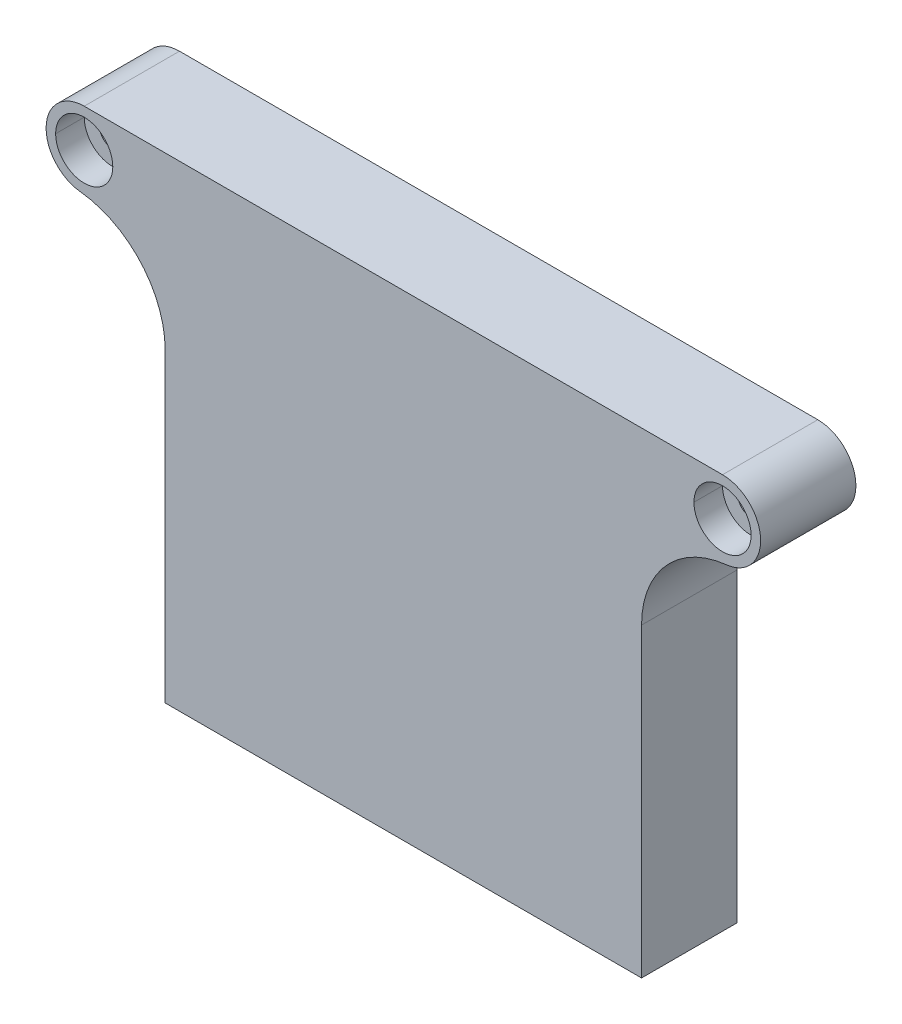
ISO-10303-21;
HEADER;
FILE_DESCRIPTION(('STEP AP214'),'2;1');
FILE_NAME('part.step','',(''),(''),'','','');
FILE_SCHEMA(('AUTOMOTIVE_DESIGN { 1 0 10303 214 1 1 1 1 }'));
ENDSEC;
DATA;
#1=APPLICATION_CONTEXT('core data for automotive mechanical design processes');
#2=APPLICATION_PROTOCOL_DEFINITION('international standard','automotive_design',2000,#1);
#3=PRODUCT_CONTEXT('',#1,'mechanical');
#4=PRODUCT('Part','Part','',(#3));
#5=PRODUCT_RELATED_PRODUCT_CATEGORY('part','',(#4));
#6=PRODUCT_DEFINITION_FORMATION('','',#4);
#7=PRODUCT_DEFINITION_CONTEXT('part definition',#1,'design');
#8=PRODUCT_DEFINITION('design','',#6,#7);
#9=PRODUCT_DEFINITION_SHAPE('','',#8);
#10=(LENGTH_UNIT() NAMED_UNIT(*) SI_UNIT(.MILLI.,.METRE.));
#11=(NAMED_UNIT(*) PLANE_ANGLE_UNIT() SI_UNIT($,.RADIAN.));
#12=(NAMED_UNIT(*) SI_UNIT($,.STERADIAN.) SOLID_ANGLE_UNIT());
#13=UNCERTAINTY_MEASURE_WITH_UNIT(LENGTH_MEASURE(1.E-05),#10,'distance_accuracy_value','');
#14=(GEOMETRIC_REPRESENTATION_CONTEXT(3) GLOBAL_UNCERTAINTY_ASSIGNED_CONTEXT((#13)) GLOBAL_UNIT_ASSIGNED_CONTEXT((#10,
#11,#12)) REPRESENTATION_CONTEXT('',''));
#15=CARTESIAN_POINT('',(0.,0.,0.));
#16=DIRECTION('',(0.,0.,1.));
#17=DIRECTION('',(1.,0.,0.));
#18=AXIS2_PLACEMENT_3D('',#15,#16,#17);
#19=CARTESIAN_POINT('',(13.5,-36.,5.));
#20=DIRECTION('',(0.,-1.,0.));
#21=DIRECTION('',(0.,0.,-1.));
#22=AXIS2_PLACEMENT_3D('',#19,#20,#21);
#23=PLANE('',#22);
#24=CARTESIAN_POINT('',(13.5,-36.,5.));
#25=DIRECTION('',(0.,-1.,0.));
#26=DIRECTION('',(1.,0.,0.));
#27=AXIS2_PLACEMENT_3D('',#24,#25,#26);
#28=CIRCLE('',#27,1.4);
#29=CARTESIAN_POINT('',(14.9,-36.,5.));
#30=VERTEX_POINT('',#29);
#31=CARTESIAN_POINT('',(12.1,-36.,5.));
#32=VERTEX_POINT('',#31);
#33=EDGE_CURVE('E10',#30,#32,#28,.T.);
#34=ORIENTED_EDGE('',*,*,#33,.T.);
#35=CARTESIAN_POINT('',(13.5,-36.,5.));
#36=DIRECTION('',(0.,-1.,0.));
#37=DIRECTION('',(1.,0.,0.));
#38=AXIS2_PLACEMENT_3D('',#35,#36,#37);
#39=CIRCLE('',#38,1.4);
#40=EDGE_CURVE('E1050',#32,#30,#39,.T.);
#41=ORIENTED_EDGE('',*,*,#40,.T.);
#42=EDGE_LOOP('',(#34,#41));
#43=FACE_BOUND('',#42,.T.);
#44=ADVANCED_FACE('F16',(#43),#23,.T.);
#45=CARTESIAN_POINT('',(13.5,-36.,5.));
#46=DIRECTION('',(0.,-1.,0.));
#47=DIRECTION('',(1.,0.,0.));
#48=AXIS2_PLACEMENT_3D('',#45,#46,#47);
#49=CYLINDRICAL_SURFACE('',#48,1.4);
#50=DIRECTION('',(0.,-1.,0.));
#51=VECTOR('',#50,1.);
#52=CARTESIAN_POINT('',(12.1,-36.,5.));
#53=LINE('',#52,#51);
#54=CARTESIAN_POINT('',(12.1,-46.,5.));
#55=VERTEX_POINT('',#54);
#56=EDGE_CURVE('E1053',#32,#55,#53,.T.);
#57=ORIENTED_EDGE('',*,*,#56,.F.);
#58=ORIENTED_EDGE('',*,*,#33,.F.);
#59=DIRECTION('',(0.,-1.,0.));
#60=VECTOR('',#59,1.);
#61=CARTESIAN_POINT('',(14.9,-36.,5.));
#62=LINE('',#61,#60);
#63=CARTESIAN_POINT('',(14.9,-46.,5.));
#64=VERTEX_POINT('',#63);
#65=EDGE_CURVE('E343',#30,#64,#62,.T.);
#66=ORIENTED_EDGE('',*,*,#65,.T.);
#67=CARTESIAN_POINT('',(13.5,-46.,5.));
#68=DIRECTION('',(0.,-1.,0.));
#69=DIRECTION('',(1.,0.,0.));
#70=AXIS2_PLACEMENT_3D('',#67,#68,#69);
#71=CIRCLE('',#70,1.4);
#72=EDGE_CURVE('E293',#64,#55,#71,.T.);
#73=ORIENTED_EDGE('',*,*,#72,.T.);
#74=EDGE_LOOP('',(#57,#58,#66,#73));
#75=FACE_BOUND('',#74,.T.);
#76=ADVANCED_FACE('F18',(#75),#49,.F.);
#77=CARTESIAN_POINT('',(53.5,-36.,5.));
#78=DIRECTION('',(0.,-1.,0.));
#79=DIRECTION('',(0.,0.,-1.));
#80=AXIS2_PLACEMENT_3D('',#77,#78,#79);
#81=PLANE('',#80);
#82=CARTESIAN_POINT('',(53.5,-36.,5.));
#83=DIRECTION('',(0.,-1.,0.));
#84=DIRECTION('',(1.,0.,0.));
#85=AXIS2_PLACEMENT_3D('',#82,#83,#84);
#86=CIRCLE('',#85,1.4);
#87=CARTESIAN_POINT('',(54.9,-36.,5.));
#88=VERTEX_POINT('',#87);
#89=CARTESIAN_POINT('',(52.1,-36.,5.));
#90=VERTEX_POINT('',#89);
#91=EDGE_CURVE('E20',#88,#90,#86,.T.);
#92=ORIENTED_EDGE('',*,*,#91,.T.);
#93=CARTESIAN_POINT('',(53.5,-36.,5.));
#94=DIRECTION('',(0.,-1.,0.));
#95=DIRECTION('',(1.,0.,0.));
#96=AXIS2_PLACEMENT_3D('',#93,#94,#95);
#97=CIRCLE('',#96,1.4);
#98=EDGE_CURVE('E325',#90,#88,#97,.T.);
#99=ORIENTED_EDGE('',*,*,#98,.T.);
#100=EDGE_LOOP('',(#92,#99));
#101=FACE_BOUND('',#100,.T.);
#102=ADVANCED_FACE('F323',(#101),#81,.T.);
#103=CARTESIAN_POINT('',(53.5,-36.,5.));
#104=DIRECTION('',(0.,-1.,0.));
#105=DIRECTION('',(1.,0.,0.));
#106=AXIS2_PLACEMENT_3D('',#103,#104,#105);
#107=CYLINDRICAL_SURFACE('',#106,1.4);
#108=DIRECTION('',(0.,-1.,0.));
#109=VECTOR('',#108,1.);
#110=CARTESIAN_POINT('',(52.1,-36.,5.));
#111=LINE('',#110,#109);
#112=CARTESIAN_POINT('',(52.1,-46.,5.));
#113=VERTEX_POINT('',#112);
#114=EDGE_CURVE('E332',#90,#113,#111,.T.);
#115=ORIENTED_EDGE('',*,*,#114,.F.);
#116=ORIENTED_EDGE('',*,*,#91,.F.);
#117=DIRECTION('',(0.,-1.,0.));
#118=VECTOR('',#117,1.);
#119=CARTESIAN_POINT('',(54.9,-36.,5.));
#120=LINE('',#119,#118);
#121=CARTESIAN_POINT('',(54.9,-46.,5.));
#122=VERTEX_POINT('',#121);
#123=EDGE_CURVE('E341',#88,#122,#120,.T.);
#124=ORIENTED_EDGE('',*,*,#123,.T.);
#125=CARTESIAN_POINT('',(53.5,-46.,5.));
#126=DIRECTION('',(0.,-1.,0.));
#127=DIRECTION('',(1.,0.,0.));
#128=AXIS2_PLACEMENT_3D('',#125,#126,#127);
#129=CIRCLE('',#128,1.4);
#130=EDGE_CURVE('E304',#122,#113,#129,.T.);
#131=ORIENTED_EDGE('',*,*,#130,.T.);
#132=EDGE_LOOP('',(#115,#116,#124,#131));
#133=FACE_BOUND('',#132,.T.);
#134=ADVANCED_FACE('F333',(#133),#107,.F.);
#135=CARTESIAN_POINT('',(33.5,-36.,5.));
#136=DIRECTION('',(0.,-1.,0.));
#137=DIRECTION('',(0.,0.,-1.));
#138=AXIS2_PLACEMENT_3D('',#135,#136,#137);
#139=PLANE('',#138);
#140=CARTESIAN_POINT('',(33.5,-36.,5.));
#141=DIRECTION('',(0.,-1.,0.));
#142=DIRECTION('',(1.,0.,0.));
#143=AXIS2_PLACEMENT_3D('',#140,#141,#142);
#144=CIRCLE('',#143,1.4);
#145=CARTESIAN_POINT('',(34.9,-36.,5.));
#146=VERTEX_POINT('',#145);
#147=CARTESIAN_POINT('',(32.1,-36.,5.));
#148=VERTEX_POINT('',#147);
#149=EDGE_CURVE('E205',#146,#148,#144,.T.);
#150=ORIENTED_EDGE('',*,*,#149,.T.);
#151=CARTESIAN_POINT('',(33.5,-36.,5.));
#152=DIRECTION('',(0.,-1.,0.));
#153=DIRECTION('',(1.,0.,0.));
#154=AXIS2_PLACEMENT_3D('',#151,#152,#153);
#155=CIRCLE('',#154,1.4);
#156=EDGE_CURVE('E364',#148,#146,#155,.T.);
#157=ORIENTED_EDGE('',*,*,#156,.T.);
#158=EDGE_LOOP('',(#150,#157));
#159=FACE_BOUND('',#158,.T.);
#160=ADVANCED_FACE('F511',(#159),#139,.T.);
#161=CARTESIAN_POINT('',(33.5,-36.,5.));
#162=DIRECTION('',(0.,-1.,0.));
#163=DIRECTION('',(1.,0.,0.));
#164=AXIS2_PLACEMENT_3D('',#161,#162,#163);
#165=CYLINDRICAL_SURFACE('',#164,1.4);
#166=DIRECTION('',(0.,-1.,0.));
#167=VECTOR('',#166,1.);
#168=CARTESIAN_POINT('',(32.1,-36.,5.));
#169=LINE('',#168,#167);
#170=CARTESIAN_POINT('',(32.1,-46.,5.));
#171=VERTEX_POINT('',#170);
#172=EDGE_CURVE('E367',#148,#171,#169,.T.);
#173=ORIENTED_EDGE('',*,*,#172,.F.);
#174=ORIENTED_EDGE('',*,*,#149,.F.);
#175=DIRECTION('',(0.,-1.,0.));
#176=VECTOR('',#175,1.);
#177=CARTESIAN_POINT('',(34.9,-36.,5.));
#178=LINE('',#177,#176);
#179=CARTESIAN_POINT('',(34.9,-46.,5.));
#180=VERTEX_POINT('',#179);
#181=EDGE_CURVE('E1033',#146,#180,#178,.T.);
#182=ORIENTED_EDGE('',*,*,#181,.T.);
#183=CARTESIAN_POINT('',(33.5,-46.,5.));
#184=DIRECTION('',(0.,-1.,0.));
#185=DIRECTION('',(1.,0.,0.));
#186=AXIS2_PLACEMENT_3D('',#183,#184,#185);
#187=CIRCLE('',#186,1.4);
#188=EDGE_CURVE('E206',#180,#171,#187,.T.);
#189=ORIENTED_EDGE('',*,*,#188,.T.);
#190=EDGE_LOOP('',(#173,#174,#182,#189));
#191=FACE_BOUND('',#190,.T.);
#192=ADVANCED_FACE('F508',(#191),#165,.F.);
#193=CARTESIAN_POINT('',(-1.5,-13.9194109070751,10.));
#194=DIRECTION('',(0.,0.,-1.));
#195=DIRECTION('',(-1.,0.,0.));
#196=AXIS2_PLACEMENT_3D('',#193,#194,#195);
#197=CYLINDRICAL_SURFACE('',#196,10.);
#198=CARTESIAN_POINT('',(-1.5,-13.9194109070751,0.));
#199=DIRECTION('',(0.,0.,1.));
#200=DIRECTION('',(1.,0.,0.));
#201=AXIS2_PLACEMENT_3D('',#198,#199,#200);
#202=CIRCLE('',#201,10.);
#203=CARTESIAN_POINT('',(8.5,-13.919410907075,0.));
#204=VERTEX_POINT('',#203);
#205=CARTESIAN_POINT('',(-0.428571428571427,-3.97697454487859,0.));
#206=VERTEX_POINT('',#205);
#207=EDGE_CURVE('E209',#204,#206,#202,.T.);
#208=ORIENTED_EDGE('',*,*,#207,.F.);
#209=DIRECTION('',(0.,0.,-1.));
#210=VECTOR('',#209,1.);
#211=CARTESIAN_POINT('',(8.5,-13.9194109070751,0.));
#212=LINE('',#211,#210);
#213=CARTESIAN_POINT('',(8.5,-13.919410907075,10.));
#214=VERTEX_POINT('',#213);
#215=EDGE_CURVE('E195',#214,#204,#212,.T.);
#216=ORIENTED_EDGE('',*,*,#215,.F.);
#217=CARTESIAN_POINT('',(-1.5,-13.9194109070751,10.));
#218=DIRECTION('',(0.,0.,-1.));
#219=DIRECTION('',(1.,0.,0.));
#220=AXIS2_PLACEMENT_3D('',#217,#218,#219);
#221=CIRCLE('',#220,10.);
#222=CARTESIAN_POINT('',(-0.428571428571427,-3.97697454487859,10.));
#223=VERTEX_POINT('',#222);
#224=EDGE_CURVE('E281',#223,#214,#221,.T.);
#225=ORIENTED_EDGE('',*,*,#224,.F.);
#226=DIRECTION('',(0.,0.,1.));
#227=VECTOR('',#226,1.);
#228=CARTESIAN_POINT('',(-0.428571428571427,-3.97697454487859,10.));
#229=LINE('',#228,#227);
#230=EDGE_CURVE('E212',#206,#223,#229,.T.);
#231=ORIENTED_EDGE('',*,*,#230,.F.);
#232=EDGE_LOOP('',(#208,#216,#225,#231));
#233=FACE_BOUND('',#232,.T.);
#234=ADVANCED_FACE('F210',(#233),#197,.F.);
#235=CARTESIAN_POINT('',(68.5,-13.9194109070751,10.));
#236=DIRECTION('',(0.,0.,-1.));
#237=DIRECTION('',(-1.,0.,0.));
#238=AXIS2_PLACEMENT_3D('',#235,#236,#237);
#239=CYLINDRICAL_SURFACE('',#238,10.);
#240=CARTESIAN_POINT('',(68.5,-13.9194109070751,0.));
#241=DIRECTION('',(0.,0.,1.));
#242=DIRECTION('',(1.,0.,0.));
#243=AXIS2_PLACEMENT_3D('',#240,#241,#242);
#244=CIRCLE('',#243,10.);
#245=CARTESIAN_POINT('',(67.4285714285714,-3.97697454487859,0.));
#246=VERTEX_POINT('',#245);
#247=CARTESIAN_POINT('',(58.5,-13.9194109070751,0.));
#248=VERTEX_POINT('',#247);
#249=EDGE_CURVE('E217',#246,#248,#244,.T.);
#250=ORIENTED_EDGE('',*,*,#249,.F.);
#251=DIRECTION('',(0.,0.,-1.));
#252=VECTOR('',#251,1.);
#253=CARTESIAN_POINT('',(67.4285714285714,-3.97697454487859,10.));
#254=LINE('',#253,#252);
#255=CARTESIAN_POINT('',(67.4285714285714,-3.97697454487859,10.));
#256=VERTEX_POINT('',#255);
#257=EDGE_CURVE('E371',#256,#246,#254,.T.);
#258=ORIENTED_EDGE('',*,*,#257,.F.);
#259=CARTESIAN_POINT('',(68.5,-13.9194109070751,10.));
#260=DIRECTION('',(0.,0.,-1.));
#261=DIRECTION('',(1.,0.,0.));
#262=AXIS2_PLACEMENT_3D('',#259,#260,#261);
#263=CIRCLE('',#262,10.);
#264=CARTESIAN_POINT('',(58.5,-13.9194109070751,10.));
#265=VERTEX_POINT('',#264);
#266=EDGE_CURVE('E275',#265,#256,#263,.T.);
#267=ORIENTED_EDGE('',*,*,#266,.F.);
#268=DIRECTION('',(0.,0.,1.));
#269=VECTOR('',#268,1.);
#270=CARTESIAN_POINT('',(58.5,-13.9194109070751,0.));
#271=LINE('',#270,#269);
#272=EDGE_CURVE('E53',#248,#265,#271,.T.);
#273=ORIENTED_EDGE('',*,*,#272,.F.);
#274=EDGE_LOOP('',(#250,#258,#267,#273));
#275=FACE_BOUND('',#274,.T.);
#276=ADVANCED_FACE('F503',(#275),#239,.F.);
#277=CARTESIAN_POINT('',(8.5,-4.,0.));
#278=DIRECTION('',(-1.,0.,0.));
#279=DIRECTION('',(0.,1.,0.));
#280=AXIS2_PLACEMENT_3D('',#277,#278,#279);
#281=PLANE('',#280);
#282=DIRECTION('',(0.,-1.,0.));
#283=VECTOR('',#282,1.);
#284=CARTESIAN_POINT('',(8.5,-4.,10.));
#285=LINE('',#284,#283);
#286=CARTESIAN_POINT('',(8.5,-46.,10.));
#287=VERTEX_POINT('',#286);
#288=EDGE_CURVE('E201',#214,#287,#285,.T.);
#289=ORIENTED_EDGE('',*,*,#288,.F.);
#290=ORIENTED_EDGE('',*,*,#215,.T.);
#291=DIRECTION('',(0.,-1.,0.));
#292=VECTOR('',#291,1.);
#293=CARTESIAN_POINT('',(8.5,-4.,0.));
#294=LINE('',#293,#292);
#295=CARTESIAN_POINT('',(8.5,-46.,0.));
#296=VERTEX_POINT('',#295);
#297=EDGE_CURVE('E199',#204,#296,#294,.T.);
#298=ORIENTED_EDGE('',*,*,#297,.T.);
#299=DIRECTION('',(0.,0.,1.));
#300=VECTOR('',#299,1.);
#301=CARTESIAN_POINT('',(8.5,-46.,0.));
#302=LINE('',#301,#300);
#303=EDGE_CURVE('E290',#296,#287,#302,.T.);
#304=ORIENTED_EDGE('',*,*,#303,.T.);
#305=EDGE_LOOP('',(#289,#290,#298,#304));
#306=FACE_BOUND('',#305,.T.);
#307=ADVANCED_FACE('F197',(#306),#281,.T.);
#308=CARTESIAN_POINT('',(8.5,-46.,0.));
#309=DIRECTION('',(0.,-1.,0.));
#310=DIRECTION('',(0.,0.,-1.));
#311=AXIS2_PLACEMENT_3D('',#308,#309,#310);
#312=PLANE('',#311);
#313=ORIENTED_EDGE('',*,*,#188,.F.);
#314=CARTESIAN_POINT('',(33.5,-46.,5.));
#315=DIRECTION('',(0.,-1.,0.));
#316=DIRECTION('',(1.,0.,0.));
#317=AXIS2_PLACEMENT_3D('',#314,#315,#316);
#318=CIRCLE('',#317,1.4);
#319=EDGE_CURVE('E375',#171,#180,#318,.T.);
#320=ORIENTED_EDGE('',*,*,#319,.F.);
#321=EDGE_LOOP('',(#313,#320));
#322=FACE_BOUND('',#321,.T.);
#323=ORIENTED_EDGE('',*,*,#130,.F.);
#324=CARTESIAN_POINT('',(53.5,-46.,5.));
#325=DIRECTION('',(0.,-1.,0.));
#326=DIRECTION('',(1.,0.,0.));
#327=AXIS2_PLACEMENT_3D('',#324,#325,#326);
#328=CIRCLE('',#327,1.4);
#329=EDGE_CURVE('E338',#113,#122,#328,.T.);
#330=ORIENTED_EDGE('',*,*,#329,.F.);
#331=EDGE_LOOP('',(#323,#330));
#332=FACE_BOUND('',#331,.T.);
#333=ORIENTED_EDGE('',*,*,#72,.F.);
#334=CARTESIAN_POINT('',(13.5,-46.,5.));
#335=DIRECTION('',(0.,-1.,0.));
#336=DIRECTION('',(1.,0.,0.));
#337=AXIS2_PLACEMENT_3D('',#334,#335,#336);
#338=CIRCLE('',#337,1.4);
#339=EDGE_CURVE('E351',#55,#64,#338,.T.);
#340=ORIENTED_EDGE('',*,*,#339,.F.);
#341=EDGE_LOOP('',(#333,#340));
#342=FACE_BOUND('',#341,.T.);
#343=DIRECTION('',(1.,0.,0.));
#344=VECTOR('',#343,1.);
#345=CARTESIAN_POINT('',(8.5,-46.,10.));
#346=LINE('',#345,#344);
#347=CARTESIAN_POINT('',(58.5,-46.,10.));
#348=VERTEX_POINT('',#347);
#349=EDGE_CURVE('E276',#287,#348,#346,.T.);
#350=ORIENTED_EDGE('',*,*,#349,.F.);
#351=ORIENTED_EDGE('',*,*,#303,.F.);
#352=DIRECTION('',(1.,0.,0.));
#353=VECTOR('',#352,1.);
#354=CARTESIAN_POINT('',(8.5,-46.,0.));
#355=LINE('',#354,#353);
#356=CARTESIAN_POINT('',(58.5,-46.,0.));
#357=VERTEX_POINT('',#356);
#358=EDGE_CURVE('E222',#296,#357,#355,.T.);
#359=ORIENTED_EDGE('',*,*,#358,.T.);
#360=DIRECTION('',(0.,0.,1.));
#361=VECTOR('',#360,1.);
#362=CARTESIAN_POINT('',(58.5,-46.,0.));
#363=LINE('',#362,#361);
#364=EDGE_CURVE('E39',#357,#348,#363,.T.);
#365=ORIENTED_EDGE('',*,*,#364,.T.);
#366=EDGE_LOOP('',(#350,#351,#359,#365));
#367=FACE_BOUND('',#366,.T.);
#368=ADVANCED_FACE('F497',(#322,#332,#342,#367),#312,.T.);
#369=CARTESIAN_POINT('',(58.5,-46.,0.));
#370=DIRECTION('',(1.,0.,0.));
#371=DIRECTION('',(0.,1.,0.));
#372=AXIS2_PLACEMENT_3D('',#369,#370,#371);
#373=PLANE('',#372);
#374=DIRECTION('',(0.,1.,0.));
#375=VECTOR('',#374,1.);
#376=CARTESIAN_POINT('',(58.5,-46.,0.));
#377=LINE('',#376,#375);
#378=EDGE_CURVE('E294',#357,#248,#377,.T.);
#379=ORIENTED_EDGE('',*,*,#378,.T.);
#380=ORIENTED_EDGE('',*,*,#272,.T.);
#381=DIRECTION('',(0.,1.,0.));
#382=VECTOR('',#381,1.);
#383=CARTESIAN_POINT('',(58.5,-46.,10.));
#384=LINE('',#383,#382);
#385=EDGE_CURVE('E271',#348,#265,#384,.T.);
#386=ORIENTED_EDGE('',*,*,#385,.F.);
#387=ORIENTED_EDGE('',*,*,#364,.F.);
#388=EDGE_LOOP('',(#379,#380,#386,#387));
#389=FACE_BOUND('',#388,.T.);
#390=ADVANCED_FACE('F495',(#389),#373,.T.);
#391=CARTESIAN_POINT('',(67.,0.,7.));
#392=DIRECTION('',(0.,0.,1.));
#393=DIRECTION('',(1.,0.,0.));
#394=AXIS2_PLACEMENT_3D('',#391,#392,#393);
#395=CYLINDRICAL_SURFACE('',#394,3.);
#396=DIRECTION('',(0.,0.,1.));
#397=VECTOR('',#396,1.);
#398=CARTESIAN_POINT('',(64.,0.,7.));
#399=LINE('',#398,#397);
#400=CARTESIAN_POINT('',(64.,0.,7.));
#401=VERTEX_POINT('',#400);
#402=CARTESIAN_POINT('',(64.,0.,10.));
#403=VERTEX_POINT('',#402);
#404=EDGE_CURVE('E376',#401,#403,#399,.T.);
#405=ORIENTED_EDGE('',*,*,#404,.F.);
#406=CARTESIAN_POINT('',(67.,0.,7.));
#407=DIRECTION('',(0.,0.,1.));
#408=DIRECTION('',(1.,0.,0.));
#409=AXIS2_PLACEMENT_3D('',#406,#407,#408);
#410=CIRCLE('',#409,3.);
#411=CARTESIAN_POINT('',(70.,0.,7.));
#412=VERTEX_POINT('',#411);
#413=EDGE_CURVE('E247',#412,#401,#410,.T.);
#414=ORIENTED_EDGE('',*,*,#413,.F.);
#415=DIRECTION('',(0.,0.,1.));
#416=VECTOR('',#415,1.);
#417=CARTESIAN_POINT('',(70.,0.,7.));
#418=LINE('',#417,#416);
#419=CARTESIAN_POINT('',(70.,0.,10.));
#420=VERTEX_POINT('',#419);
#421=EDGE_CURVE('E387',#412,#420,#418,.T.);
#422=ORIENTED_EDGE('',*,*,#421,.T.);
#423=CARTESIAN_POINT('',(67.,0.,10.));
#424=DIRECTION('',(0.,0.,1.));
#425=DIRECTION('',(1.,0.,0.));
#426=AXIS2_PLACEMENT_3D('',#423,#424,#425);
#427=CIRCLE('',#426,3.);
#428=EDGE_CURVE('E224',#420,#403,#427,.T.);
#429=ORIENTED_EDGE('',*,*,#428,.T.);
#430=EDGE_LOOP('',(#405,#414,#422,#429));
#431=FACE_BOUND('',#430,.T.);
#432=ADVANCED_FACE('F492',(#431),#395,.F.);
#433=CARTESIAN_POINT('',(67.,0.,7.));
#434=DIRECTION('',(0.,0.,1.));
#435=DIRECTION('',(1.,0.,0.));
#436=AXIS2_PLACEMENT_3D('',#433,#434,#435);
#437=PLANE('',#436);
#438=CARTESIAN_POINT('',(67.,0.,7.));
#439=DIRECTION('',(0.,0.,-1.));
#440=DIRECTION('',(1.,0.,0.));
#441=AXIS2_PLACEMENT_3D('',#438,#439,#440);
#442=CIRCLE('',#441,1.4);
#443=CARTESIAN_POINT('',(68.4,0.,7.));
#444=VERTEX_POINT('',#443);
#445=CARTESIAN_POINT('',(65.6,0.,7.));
#446=VERTEX_POINT('',#445);
#447=EDGE_CURVE('E235',#444,#446,#442,.T.);
#448=ORIENTED_EDGE('',*,*,#447,.T.);
#449=CARTESIAN_POINT('',(67.,0.,7.));
#450=DIRECTION('',(0.,0.,-1.));
#451=DIRECTION('',(1.,0.,0.));
#452=AXIS2_PLACEMENT_3D('',#449,#450,#451);
#453=CIRCLE('',#452,1.4);
#454=EDGE_CURVE('E243',#446,#444,#453,.T.);
#455=ORIENTED_EDGE('',*,*,#454,.T.);
#456=EDGE_LOOP('',(#448,#455));
#457=FACE_BOUND('',#456,.T.);
#458=ORIENTED_EDGE('',*,*,#413,.T.);
#459=CARTESIAN_POINT('',(67.,0.,7.));
#460=DIRECTION('',(0.,0.,1.));
#461=DIRECTION('',(1.,0.,0.));
#462=AXIS2_PLACEMENT_3D('',#459,#460,#461);
#463=CIRCLE('',#462,3.);
#464=EDGE_CURVE('E355',#401,#412,#463,.T.);
#465=ORIENTED_EDGE('',*,*,#464,.T.);
#466=EDGE_LOOP('',(#458,#465));
#467=FACE_BOUND('',#466,.T.);
#468=ADVANCED_FACE('F457',(#457,#467),#437,.T.);
#469=CARTESIAN_POINT('',(0.,0.,7.));
#470=DIRECTION('',(0.,0.,1.));
#471=DIRECTION('',(1.,0.,0.));
#472=AXIS2_PLACEMENT_3D('',#469,#470,#471);
#473=CYLINDRICAL_SURFACE('',#472,3.);
#474=DIRECTION('',(0.,0.,1.));
#475=VECTOR('',#474,1.);
#476=CARTESIAN_POINT('',(-3.,0.,7.));
#477=LINE('',#476,#475);
#478=CARTESIAN_POINT('',(-3.,0.,7.));
#479=VERTEX_POINT('',#478);
#480=CARTESIAN_POINT('',(-3.,0.,10.));
#481=VERTEX_POINT('',#480);
#482=EDGE_CURVE('E392',#479,#481,#477,.T.);
#483=ORIENTED_EDGE('',*,*,#482,.F.);
#484=CARTESIAN_POINT('',(0.,0.,7.));
#485=DIRECTION('',(0.,0.,1.));
#486=DIRECTION('',(1.,0.,0.));
#487=AXIS2_PLACEMENT_3D('',#484,#485,#486);
#488=CIRCLE('',#487,3.);
#489=CARTESIAN_POINT('',(3.,0.,7.));
#490=VERTEX_POINT('',#489);
#491=EDGE_CURVE('E250',#490,#479,#488,.T.);
#492=ORIENTED_EDGE('',*,*,#491,.F.);
#493=DIRECTION('',(0.,0.,1.));
#494=VECTOR('',#493,1.);
#495=CARTESIAN_POINT('',(3.,0.,7.));
#496=LINE('',#495,#494);
#497=CARTESIAN_POINT('',(3.,0.,10.));
#498=VERTEX_POINT('',#497);
#499=EDGE_CURVE('E402',#490,#498,#496,.T.);
#500=ORIENTED_EDGE('',*,*,#499,.T.);
#501=CARTESIAN_POINT('',(0.,0.,10.));
#502=DIRECTION('',(0.,0.,1.));
#503=DIRECTION('',(1.,0.,0.));
#504=AXIS2_PLACEMENT_3D('',#501,#502,#503);
#505=CIRCLE('',#504,3.);
#506=EDGE_CURVE('E231',#498,#481,#505,.T.);
#507=ORIENTED_EDGE('',*,*,#506,.T.);
#508=EDGE_LOOP('',(#483,#492,#500,#507));
#509=FACE_BOUND('',#508,.T.);
#510=ADVANCED_FACE('F488',(#509),#473,.F.);
#511=CARTESIAN_POINT('',(0.,0.,7.));
#512=DIRECTION('',(0.,0.,1.));
#513=DIRECTION('',(1.,0.,0.));
#514=AXIS2_PLACEMENT_3D('',#511,#512,#513);
#515=PLANE('',#514);
#516=CARTESIAN_POINT('',(0.,0.,7.));
#517=DIRECTION('',(0.,0.,-1.));
#518=DIRECTION('',(1.,0.,0.));
#519=AXIS2_PLACEMENT_3D('',#516,#517,#518);
#520=CIRCLE('',#519,1.4);
#521=CARTESIAN_POINT('',(1.4,0.,7.));
#522=VERTEX_POINT('',#521);
#523=CARTESIAN_POINT('',(-1.4,0.,7.));
#524=VERTEX_POINT('',#523);
#525=EDGE_CURVE('E425',#522,#524,#520,.T.);
#526=ORIENTED_EDGE('',*,*,#525,.T.);
#527=CARTESIAN_POINT('',(0.,0.,7.));
#528=DIRECTION('',(0.,0.,-1.));
#529=DIRECTION('',(1.,0.,0.));
#530=AXIS2_PLACEMENT_3D('',#527,#528,#529);
#531=CIRCLE('',#530,1.4);
#532=EDGE_CURVE('E253',#524,#522,#531,.T.);
#533=ORIENTED_EDGE('',*,*,#532,.T.);
#534=EDGE_LOOP('',(#526,#533));
#535=FACE_BOUND('',#534,.T.);
#536=ORIENTED_EDGE('',*,*,#491,.T.);
#537=CARTESIAN_POINT('',(0.,0.,7.));
#538=DIRECTION('',(0.,0.,1.));
#539=DIRECTION('',(1.,0.,0.));
#540=AXIS2_PLACEMENT_3D('',#537,#538,#539);
#541=CIRCLE('',#540,3.);
#542=EDGE_CURVE('E388',#479,#490,#541,.T.);
#543=ORIENTED_EDGE('',*,*,#542,.T.);
#544=EDGE_LOOP('',(#536,#543));
#545=FACE_BOUND('',#544,.T.);
#546=ADVANCED_FACE('F583',(#535,#545),#515,.T.);
#547=CARTESIAN_POINT('',(0.,0.,0.));
#548=DIRECTION('',(0.,0.,1.));
#549=DIRECTION('',(1.,0.,0.));
#550=AXIS2_PLACEMENT_3D('',#547,#548,#549);
#551=PLANE('',#550);
#552=CARTESIAN_POINT('',(67.,0.,0.));
#553=DIRECTION('',(0.,0.,1.));
#554=DIRECTION('',(1.,0.,0.));
#555=AXIS2_PLACEMENT_3D('',#552,#553,#554);
#556=CIRCLE('',#555,1.4);
#557=CARTESIAN_POINT('',(68.4,0.,0.));
#558=VERTEX_POINT('',#557);
#559=CARTESIAN_POINT('',(65.6,0.,0.));
#560=VERTEX_POINT('',#559);
#561=EDGE_CURVE('E240',#558,#560,#556,.T.);
#562=ORIENTED_EDGE('',*,*,#561,.T.);
#563=CARTESIAN_POINT('',(67.,0.,0.));
#564=DIRECTION('',(0.,0.,1.));
#565=DIRECTION('',(1.,0.,0.));
#566=AXIS2_PLACEMENT_3D('',#563,#564,#565);
#567=CIRCLE('',#566,1.4);
#568=EDGE_CURVE('E439',#560,#558,#567,.T.);
#569=ORIENTED_EDGE('',*,*,#568,.T.);
#570=EDGE_LOOP('',(#562,#569));
#571=FACE_BOUND('',#570,.T.);
#572=CARTESIAN_POINT('',(0.,0.,0.));
#573=DIRECTION('',(0.,0.,1.));
#574=DIRECTION('',(1.,0.,0.));
#575=AXIS2_PLACEMENT_3D('',#572,#573,#574);
#576=CIRCLE('',#575,1.4);
#577=CARTESIAN_POINT('',(1.4,0.,0.));
#578=VERTEX_POINT('',#577);
#579=CARTESIAN_POINT('',(-1.4,0.,0.));
#580=VERTEX_POINT('',#579);
#581=EDGE_CURVE('E246',#578,#580,#576,.T.);
#582=ORIENTED_EDGE('',*,*,#581,.T.);
#583=CARTESIAN_POINT('',(0.,0.,0.));
#584=DIRECTION('',(0.,0.,1.));
#585=DIRECTION('',(1.,0.,0.));
#586=AXIS2_PLACEMENT_3D('',#583,#584,#585);
#587=CIRCLE('',#586,1.4);
#588=EDGE_CURVE('E357',#580,#578,#587,.T.);
#589=ORIENTED_EDGE('',*,*,#588,.T.);
#590=EDGE_LOOP('',(#582,#589));
#591=FACE_BOUND('',#590,.T.);
#592=ORIENTED_EDGE('',*,*,#297,.F.);
#593=ORIENTED_EDGE('',*,*,#207,.T.);
#594=CARTESIAN_POINT('',(0.,0.,0.));
#595=DIRECTION('',(0.,0.,1.));
#596=DIRECTION('',(1.,0.,0.));
#597=AXIS2_PLACEMENT_3D('',#594,#595,#596);
#598=CIRCLE('',#597,4.);
#599=CARTESIAN_POINT('',(-4.,0.,0.));
#600=VERTEX_POINT('',#599);
#601=EDGE_CURVE('E358',#600,#206,#598,.T.);
#602=ORIENTED_EDGE('',*,*,#601,.F.);
#603=CARTESIAN_POINT('',(0.,0.,0.));
#604=DIRECTION('',(0.,0.,1.));
#605=DIRECTION('',(1.,0.,0.));
#606=AXIS2_PLACEMENT_3D('',#603,#604,#605);
#607=CIRCLE('',#606,4.);
#608=CARTESIAN_POINT('',(0.,4.,0.));
#609=VERTEX_POINT('',#608);
#610=EDGE_CURVE('E280',#609,#600,#607,.T.);
#611=ORIENTED_EDGE('',*,*,#610,.F.);
#612=DIRECTION('',(1.,0.,0.));
#613=VECTOR('',#612,1.);
#614=CARTESIAN_POINT('',(0.,4.,0.));
#615=LINE('',#614,#613);
#616=CARTESIAN_POINT('',(67.,4.,0.));
#617=VERTEX_POINT('',#616);
#618=EDGE_CURVE('E261',#609,#617,#615,.T.);
#619=ORIENTED_EDGE('',*,*,#618,.T.);
#620=CARTESIAN_POINT('',(67.,0.,0.));
#621=DIRECTION('',(0.,0.,1.));
#622=DIRECTION('',(1.,0.,0.));
#623=AXIS2_PLACEMENT_3D('',#620,#621,#622);
#624=CIRCLE('',#623,4.);
#625=EDGE_CURVE('E262',#246,#617,#624,.T.);
#626=ORIENTED_EDGE('',*,*,#625,.F.);
#627=ORIENTED_EDGE('',*,*,#249,.T.);
#628=ORIENTED_EDGE('',*,*,#378,.F.);
#629=ORIENTED_EDGE('',*,*,#358,.F.);
#630=EDGE_LOOP('',(#592,#593,#602,#611,#619,#626,#627,#628,#629));
#631=FACE_BOUND('',#630,.T.);
#632=ADVANCED_FACE('F220',(#571,#591,#631),#551,.F.);
#633=CARTESIAN_POINT('',(0.,0.,10.));
#634=DIRECTION('',(0.,0.,1.));
#635=DIRECTION('',(1.,0.,0.));
#636=AXIS2_PLACEMENT_3D('',#633,#634,#635);
#637=PLANE('',#636);
#638=ORIENTED_EDGE('',*,*,#428,.F.);
#639=CARTESIAN_POINT('',(67.,0.,10.));
#640=DIRECTION('',(0.,0.,1.));
#641=DIRECTION('',(1.,0.,0.));
#642=AXIS2_PLACEMENT_3D('',#639,#640,#641);
#643=CIRCLE('',#642,3.);
#644=EDGE_CURVE('E380',#403,#420,#643,.T.);
#645=ORIENTED_EDGE('',*,*,#644,.F.);
#646=EDGE_LOOP('',(#638,#645));
#647=FACE_BOUND('',#646,.T.);
#648=ORIENTED_EDGE('',*,*,#506,.F.);
#649=CARTESIAN_POINT('',(0.,0.,10.));
#650=DIRECTION('',(0.,0.,1.));
#651=DIRECTION('',(1.,0.,0.));
#652=AXIS2_PLACEMENT_3D('',#649,#650,#651);
#653=CIRCLE('',#652,3.);
#654=EDGE_CURVE('E397',#481,#498,#653,.T.);
#655=ORIENTED_EDGE('',*,*,#654,.F.);
#656=EDGE_LOOP('',(#648,#655));
#657=FACE_BOUND('',#656,.T.);
#658=CARTESIAN_POINT('',(0.,0.,10.));
#659=DIRECTION('',(0.,0.,1.));
#660=DIRECTION('',(1.,0.,0.));
#661=AXIS2_PLACEMENT_3D('',#658,#659,#660);
#662=CIRCLE('',#661,4.);
#663=CARTESIAN_POINT('',(0.,4.,10.));
#664=VERTEX_POINT('',#663);
#665=CARTESIAN_POINT('',(-4.,0.,10.));
#666=VERTEX_POINT('',#665);
#667=EDGE_CURVE('E277',#664,#666,#662,.T.);
#668=ORIENTED_EDGE('',*,*,#667,.T.);
#669=CARTESIAN_POINT('',(0.,0.,10.));
#670=DIRECTION('',(0.,0.,1.));
#671=DIRECTION('',(1.,0.,0.));
#672=AXIS2_PLACEMENT_3D('',#669,#670,#671);
#673=CIRCLE('',#672,4.);
#674=EDGE_CURVE('E406',#666,#223,#673,.T.);
#675=ORIENTED_EDGE('',*,*,#674,.T.);
#676=ORIENTED_EDGE('',*,*,#224,.T.);
#677=ORIENTED_EDGE('',*,*,#288,.T.);
#678=ORIENTED_EDGE('',*,*,#349,.T.);
#679=ORIENTED_EDGE('',*,*,#385,.T.);
#680=ORIENTED_EDGE('',*,*,#266,.T.);
#681=CARTESIAN_POINT('',(67.,0.,10.));
#682=DIRECTION('',(0.,0.,1.));
#683=DIRECTION('',(1.,0.,0.));
#684=AXIS2_PLACEMENT_3D('',#681,#682,#683);
#685=CIRCLE('',#684,4.);
#686=CARTESIAN_POINT('',(67.,4.,10.));
#687=VERTEX_POINT('',#686);
#688=EDGE_CURVE('E256',#256,#687,#685,.T.);
#689=ORIENTED_EDGE('',*,*,#688,.T.);
#690=DIRECTION('',(1.,0.,0.));
#691=VECTOR('',#690,1.);
#692=CARTESIAN_POINT('',(0.,4.,10.));
#693=LINE('',#692,#691);
#694=EDGE_CURVE('E270',#664,#687,#693,.T.);
#695=ORIENTED_EDGE('',*,*,#694,.F.);
#696=EDGE_LOOP('',(#668,#675,#676,#677,#678,#679,#680,#689,#695));
#697=FACE_BOUND('',#696,.T.);
#698=ADVANCED_FACE('F598',(#647,#657,#697),#637,.T.);
#699=CARTESIAN_POINT('',(0.,0.,10.));
#700=DIRECTION('',(0.,0.,-1.));
#701=DIRECTION('',(-1.,0.,0.));
#702=AXIS2_PLACEMENT_3D('',#699,#700,#701);
#703=CYLINDRICAL_SURFACE('',#702,4.);
#704=DIRECTION('',(0.,0.,-1.));
#705=VECTOR('',#704,1.);
#706=CARTESIAN_POINT('',(-4.,0.,10.));
#707=LINE('',#706,#705);
#708=EDGE_CURVE('E412',#666,#600,#707,.T.);
#709=ORIENTED_EDGE('',*,*,#708,.F.);
#710=ORIENTED_EDGE('',*,*,#667,.F.);
#711=DIRECTION('',(0.,0.,-1.));
#712=VECTOR('',#711,1.);
#713=CARTESIAN_POINT('',(0.,4.,10.));
#714=LINE('',#713,#712);
#715=EDGE_CURVE('E266',#664,#609,#714,.T.);
#716=ORIENTED_EDGE('',*,*,#715,.T.);
#717=ORIENTED_EDGE('',*,*,#610,.T.);
#718=EDGE_LOOP('',(#709,#710,#716,#717));
#719=FACE_BOUND('',#718,.T.);
#720=ADVANCED_FACE('F606',(#719),#703,.T.);
#721=CARTESIAN_POINT('',(0.,4.,10.));
#722=DIRECTION('',(0.,1.,0.));
#723=DIRECTION('',(1.,0.,0.));
#724=AXIS2_PLACEMENT_3D('',#721,#722,#723);
#725=PLANE('',#724);
#726=ORIENTED_EDGE('',*,*,#618,.F.);
#727=ORIENTED_EDGE('',*,*,#715,.F.);
#728=ORIENTED_EDGE('',*,*,#694,.T.);
#729=DIRECTION('',(0.,0.,-1.));
#730=VECTOR('',#729,1.);
#731=CARTESIAN_POINT('',(67.,4.,10.));
#732=LINE('',#731,#730);
#733=EDGE_CURVE('E257',#687,#617,#732,.T.);
#734=ORIENTED_EDGE('',*,*,#733,.T.);
#735=EDGE_LOOP('',(#726,#727,#728,#734));
#736=FACE_BOUND('',#735,.T.);
#737=ADVANCED_FACE('F615',(#736),#725,.T.);
#738=CARTESIAN_POINT('',(67.,0.,10.));
#739=DIRECTION('',(0.,0.,-1.));
#740=DIRECTION('',(-1.,0.,0.));
#741=AXIS2_PLACEMENT_3D('',#738,#739,#740);
#742=CYLINDRICAL_SURFACE('',#741,4.);
#743=ORIENTED_EDGE('',*,*,#688,.F.);
#744=ORIENTED_EDGE('',*,*,#257,.T.);
#745=ORIENTED_EDGE('',*,*,#625,.T.);
#746=ORIENTED_EDGE('',*,*,#733,.F.);
#747=EDGE_LOOP('',(#743,#744,#745,#746));
#748=FACE_BOUND('',#747,.T.);
#749=ADVANCED_FACE('F475',(#748),#742,.T.);
#750=CARTESIAN_POINT('',(0.,0.,0.));
#751=DIRECTION('',(0.,0.,1.));
#752=DIRECTION('',(1.,0.,0.));
#753=AXIS2_PLACEMENT_3D('',#750,#751,#752);
#754=CYLINDRICAL_SURFACE('',#753,1.4);
#755=DIRECTION('',(0.,0.,1.));
#756=VECTOR('',#755,1.);
#757=CARTESIAN_POINT('',(-1.4,0.,0.));
#758=LINE('',#757,#756);
#759=EDGE_CURVE('E421',#580,#524,#758,.T.);
#760=ORIENTED_EDGE('',*,*,#759,.F.);
#761=ORIENTED_EDGE('',*,*,#581,.F.);
#762=DIRECTION('',(0.,0.,1.));
#763=VECTOR('',#762,1.);
#764=CARTESIAN_POINT('',(1.4,0.,0.));
#765=LINE('',#764,#763);
#766=EDGE_CURVE('E432',#578,#522,#765,.T.);
#767=ORIENTED_EDGE('',*,*,#766,.T.);
#768=ORIENTED_EDGE('',*,*,#532,.F.);
#769=EDGE_LOOP('',(#760,#761,#767,#768));
#770=FACE_BOUND('',#769,.T.);
#771=ADVANCED_FACE('F466',(#770),#754,.F.);
#772=CARTESIAN_POINT('',(67.,0.,0.));
#773=DIRECTION('',(0.,0.,1.));
#774=DIRECTION('',(1.,0.,0.));
#775=AXIS2_PLACEMENT_3D('',#772,#773,#774);
#776=CYLINDRICAL_SURFACE('',#775,1.4);
#777=DIRECTION('',(0.,0.,1.));
#778=VECTOR('',#777,1.);
#779=CARTESIAN_POINT('',(65.6,0.,0.));
#780=LINE('',#779,#778);
#781=EDGE_CURVE('E444',#560,#446,#780,.T.);
#782=ORIENTED_EDGE('',*,*,#781,.F.);
#783=ORIENTED_EDGE('',*,*,#561,.F.);
#784=DIRECTION('',(0.,0.,1.));
#785=VECTOR('',#784,1.);
#786=CARTESIAN_POINT('',(68.4,0.,0.));
#787=LINE('',#786,#785);
#788=EDGE_CURVE('E237',#558,#444,#787,.T.);
#789=ORIENTED_EDGE('',*,*,#788,.T.);
#790=ORIENTED_EDGE('',*,*,#454,.F.);
#791=EDGE_LOOP('',(#782,#783,#789,#790));
#792=FACE_BOUND('',#791,.T.);
#793=ADVANCED_FACE('F464',(#792),#776,.F.);
#794=CARTESIAN_POINT('',(67.,0.,0.));
#795=DIRECTION('',(0.,0.,1.));
#796=DIRECTION('',(1.,0.,0.));
#797=AXIS2_PLACEMENT_3D('',#794,#795,#796);
#798=CYLINDRICAL_SURFACE('',#797,1.4);
#799=ORIENTED_EDGE('',*,*,#568,.F.);
#800=ORIENTED_EDGE('',*,*,#781,.T.);
#801=ORIENTED_EDGE('',*,*,#447,.F.);
#802=ORIENTED_EDGE('',*,*,#788,.F.);
#803=EDGE_LOOP('',(#799,#800,#801,#802));
#804=FACE_BOUND('',#803,.T.);
#805=ADVANCED_FACE('F460',(#804),#798,.F.);
#806=CARTESIAN_POINT('',(0.,0.,0.));
#807=DIRECTION('',(0.,0.,1.));
#808=DIRECTION('',(1.,0.,0.));
#809=AXIS2_PLACEMENT_3D('',#806,#807,#808);
#810=CYLINDRICAL_SURFACE('',#809,1.4);
#811=ORIENTED_EDGE('',*,*,#588,.F.);
#812=ORIENTED_EDGE('',*,*,#759,.T.);
#813=ORIENTED_EDGE('',*,*,#525,.F.);
#814=ORIENTED_EDGE('',*,*,#766,.F.);
#815=EDGE_LOOP('',(#811,#812,#813,#814));
#816=FACE_BOUND('',#815,.T.);
#817=ADVANCED_FACE('F473',(#816),#810,.F.);
#818=CARTESIAN_POINT('',(0.,0.,10.));
#819=DIRECTION('',(0.,0.,-1.));
#820=DIRECTION('',(-1.,0.,0.));
#821=AXIS2_PLACEMENT_3D('',#818,#819,#820);
#822=CYLINDRICAL_SURFACE('',#821,4.);
#823=ORIENTED_EDGE('',*,*,#674,.F.);
#824=ORIENTED_EDGE('',*,*,#708,.T.);
#825=ORIENTED_EDGE('',*,*,#601,.T.);
#826=ORIENTED_EDGE('',*,*,#230,.T.);
#827=EDGE_LOOP('',(#823,#824,#825,#826));
#828=FACE_BOUND('',#827,.T.);
#829=ADVANCED_FACE('F662',(#828),#822,.T.);
#830=CARTESIAN_POINT('',(0.,0.,7.));
#831=DIRECTION('',(0.,0.,1.));
#832=DIRECTION('',(1.,0.,0.));
#833=AXIS2_PLACEMENT_3D('',#830,#831,#832);
#834=CYLINDRICAL_SURFACE('',#833,3.);
#835=ORIENTED_EDGE('',*,*,#542,.F.);
#836=ORIENTED_EDGE('',*,*,#482,.T.);
#837=ORIENTED_EDGE('',*,*,#654,.T.);
#838=ORIENTED_EDGE('',*,*,#499,.F.);
#839=EDGE_LOOP('',(#835,#836,#837,#838));
#840=FACE_BOUND('',#839,.T.);
#841=ADVANCED_FACE('F672',(#840),#834,.F.);
#842=CARTESIAN_POINT('',(67.,0.,7.));
#843=DIRECTION('',(0.,0.,1.));
#844=DIRECTION('',(1.,0.,0.));
#845=AXIS2_PLACEMENT_3D('',#842,#843,#844);
#846=CYLINDRICAL_SURFACE('',#845,3.);
#847=ORIENTED_EDGE('',*,*,#464,.F.);
#848=ORIENTED_EDGE('',*,*,#404,.T.);
#849=ORIENTED_EDGE('',*,*,#644,.T.);
#850=ORIENTED_EDGE('',*,*,#421,.F.);
#851=EDGE_LOOP('',(#847,#848,#849,#850));
#852=FACE_BOUND('',#851,.T.);
#853=ADVANCED_FACE('F683',(#852),#846,.F.);
#854=CARTESIAN_POINT('',(33.5,-36.,5.));
#855=DIRECTION('',(0.,-1.,0.));
#856=DIRECTION('',(1.,0.,0.));
#857=AXIS2_PLACEMENT_3D('',#854,#855,#856);
#858=CYLINDRICAL_SURFACE('',#857,1.4);
#859=ORIENTED_EDGE('',*,*,#156,.F.);
#860=ORIENTED_EDGE('',*,*,#172,.T.);
#861=ORIENTED_EDGE('',*,*,#319,.T.);
#862=ORIENTED_EDGE('',*,*,#181,.F.);
#863=EDGE_LOOP('',(#859,#860,#861,#862));
#864=FACE_BOUND('',#863,.T.);
#865=ADVANCED_FACE('F694',(#864),#858,.F.);
#866=CARTESIAN_POINT('',(53.5,-36.,5.));
#867=DIRECTION('',(0.,-1.,0.));
#868=DIRECTION('',(1.,0.,0.));
#869=AXIS2_PLACEMENT_3D('',#866,#867,#868);
#870=CYLINDRICAL_SURFACE('',#869,1.4);
#871=ORIENTED_EDGE('',*,*,#98,.F.);
#872=ORIENTED_EDGE('',*,*,#114,.T.);
#873=ORIENTED_EDGE('',*,*,#329,.T.);
#874=ORIENTED_EDGE('',*,*,#123,.F.);
#875=EDGE_LOOP('',(#871,#872,#873,#874));
#876=FACE_BOUND('',#875,.T.);
#877=ADVANCED_FACE('F340',(#876),#870,.F.);
#878=CARTESIAN_POINT('',(13.5,-36.,5.));
#879=DIRECTION('',(0.,-1.,0.));
#880=DIRECTION('',(1.,0.,0.));
#881=AXIS2_PLACEMENT_3D('',#878,#879,#880);
#882=CYLINDRICAL_SURFACE('',#881,1.4);
#883=ORIENTED_EDGE('',*,*,#40,.F.);
#884=ORIENTED_EDGE('',*,*,#56,.T.);
#885=ORIENTED_EDGE('',*,*,#339,.T.);
#886=ORIENTED_EDGE('',*,*,#65,.F.);
#887=EDGE_LOOP('',(#883,#884,#885,#886));
#888=FACE_BOUND('',#887,.T.);
#889=ADVANCED_FACE('F716',(#888),#882,.F.);
#890=CLOSED_SHELL('',(#44,#76,#102,#134,#160,#192,#234,#276,#307,#368,#390,#432,#468,#510,#546,
#632,#698,#720,#737,#749,#771,#793,#805,#817,#829,#841,#853,#865,#877,#889));
#891=MANIFOLD_SOLID_BREP('B1',#890);
#892=ADVANCED_BREP_SHAPE_REPRESENTATION('',(#18,#891),#14);
#893=SHAPE_DEFINITION_REPRESENTATION(#9,#892);
ENDSEC;
END-ISO-10303-21;
